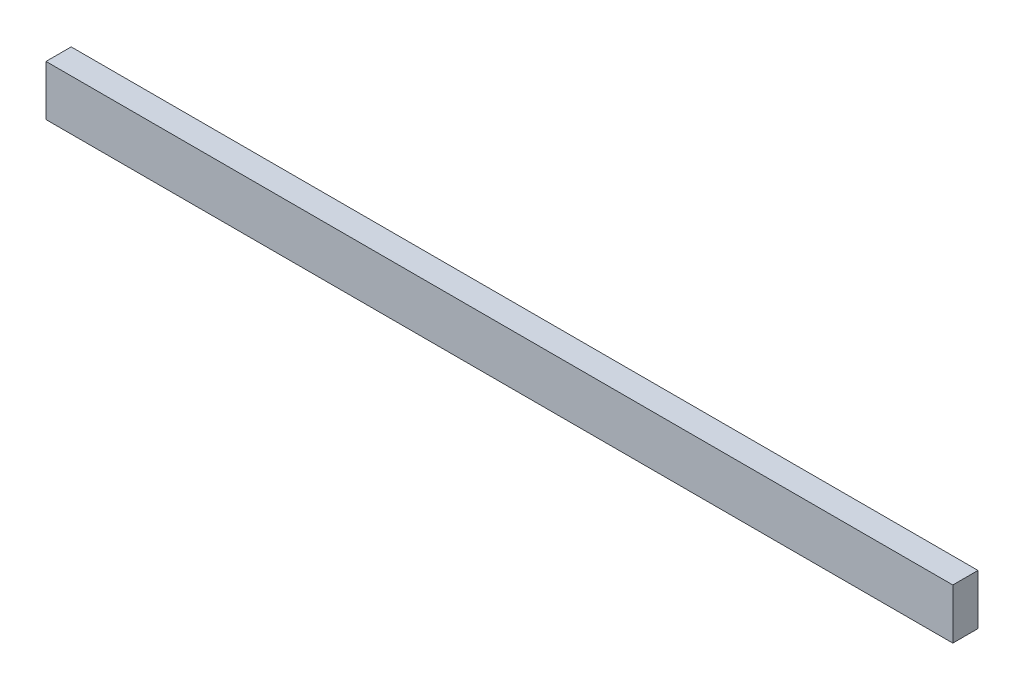
ISO-10303-21;
HEADER;
FILE_DESCRIPTION(('STEP AP214'),'2;1');
FILE_NAME('part.step','',(''),(''),'','','');
FILE_SCHEMA(('AUTOMOTIVE_DESIGN { 1 0 10303 214 1 1 1 1 }'));
ENDSEC;
DATA;
#1=APPLICATION_CONTEXT('core data for automotive mechanical design processes');
#2=APPLICATION_PROTOCOL_DEFINITION('international standard','automotive_design',2000,#1);
#3=PRODUCT_CONTEXT('',#1,'mechanical');
#4=PRODUCT('Part','Part','',(#3));
#5=PRODUCT_RELATED_PRODUCT_CATEGORY('part','',(#4));
#6=PRODUCT_DEFINITION_FORMATION('','',#4);
#7=PRODUCT_DEFINITION_CONTEXT('part definition',#1,'design');
#8=PRODUCT_DEFINITION('design','',#6,#7);
#9=PRODUCT_DEFINITION_SHAPE('','',#8);
#10=(LENGTH_UNIT() NAMED_UNIT(*) SI_UNIT(.MILLI.,.METRE.));
#11=(NAMED_UNIT(*) PLANE_ANGLE_UNIT() SI_UNIT($,.RADIAN.));
#12=(NAMED_UNIT(*) SI_UNIT($,.STERADIAN.) SOLID_ANGLE_UNIT());
#13=UNCERTAINTY_MEASURE_WITH_UNIT(LENGTH_MEASURE(1.E-05),#10,'distance_accuracy_value','');
#14=(GEOMETRIC_REPRESENTATION_CONTEXT(3) GLOBAL_UNCERTAINTY_ASSIGNED_CONTEXT((#13)) GLOBAL_UNIT_ASSIGNED_CONTEXT((#10,
#11,#12)) REPRESENTATION_CONTEXT('',''));
#15=CARTESIAN_POINT('',(0.,0.,0.));
#16=DIRECTION('',(0.,0.,1.));
#17=DIRECTION('',(1.,0.,0.));
#18=AXIS2_PLACEMENT_3D('',#15,#16,#17);
#19=CARTESIAN_POINT('',(1080.,-30.,-15.));
#20=DIRECTION('',(0.,0.,1.));
#21=DIRECTION('',(1.,0.,0.));
#22=AXIS2_PLACEMENT_3D('',#19,#20,#21);
#23=PLANE('',#22);
#24=DIRECTION('',(0.,1.,0.));
#25=VECTOR('',#24,1.);
#26=CARTESIAN_POINT('',(0.,-30.,-15.));
#27=LINE('',#26,#25);
#28=CARTESIAN_POINT('',(0.,-30.,-15.));
#29=VERTEX_POINT('',#28);
#30=CARTESIAN_POINT('',(0.,30.,-15.));
#31=VERTEX_POINT('',#30);
#32=EDGE_CURVE('E107',#29,#31,#27,.T.);
#33=ORIENTED_EDGE('',*,*,#32,.T.);
#34=DIRECTION('',(-1.,0.,0.));
#35=VECTOR('',#34,1.);
#36=CARTESIAN_POINT('',(1080.,30.,-15.));
#37=LINE('',#36,#35);
#38=CARTESIAN_POINT('',(1080.,30.,-15.));
#39=VERTEX_POINT('',#38);
#40=EDGE_CURVE('E11',#39,#31,#37,.T.);
#41=ORIENTED_EDGE('',*,*,#40,.F.);
#42=DIRECTION('',(0.,1.,0.));
#43=VECTOR('',#42,1.);
#44=CARTESIAN_POINT('',(1080.,-30.,-15.));
#45=LINE('',#44,#43);
#46=CARTESIAN_POINT('',(1080.,-30.,-15.));
#47=VERTEX_POINT('',#46);
#48=EDGE_CURVE('E91',#47,#39,#45,.T.);
#49=ORIENTED_EDGE('',*,*,#48,.F.);
#50=DIRECTION('',(-1.,0.,0.));
#51=VECTOR('',#50,1.);
#52=CARTESIAN_POINT('',(1080.,-30.,-15.));
#53=LINE('',#52,#51);
#54=EDGE_CURVE('E103',#47,#29,#53,.T.);
#55=ORIENTED_EDGE('',*,*,#54,.T.);
#56=EDGE_LOOP('',(#33,#41,#49,#55));
#57=FACE_BOUND('',#56,.T.);
#58=ADVANCED_FACE('F39',(#57),#23,.F.);
#59=CARTESIAN_POINT('',(1080.,30.,15.));
#60=DIRECTION('',(0.,-1.,0.));
#61=DIRECTION('',(0.,0.,-1.));
#62=AXIS2_PLACEMENT_3D('',#59,#60,#61);
#63=PLANE('',#62);
#64=DIRECTION('',(0.,0.,1.));
#65=VECTOR('',#64,1.);
#66=CARTESIAN_POINT('',(0.,30.,15.));
#67=LINE('',#66,#65);
#68=CARTESIAN_POINT('',(0.,30.,15.));
#69=VERTEX_POINT('',#68);
#70=EDGE_CURVE('E96',#31,#69,#67,.T.);
#71=ORIENTED_EDGE('',*,*,#70,.T.);
#72=DIRECTION('',(-1.,0.,0.));
#73=VECTOR('',#72,1.);
#74=CARTESIAN_POINT('',(1080.,30.,15.));
#75=LINE('',#74,#73);
#76=CARTESIAN_POINT('',(1080.,30.,15.));
#77=VERTEX_POINT('',#76);
#78=EDGE_CURVE('E48',#77,#69,#75,.T.);
#79=ORIENTED_EDGE('',*,*,#78,.F.);
#80=DIRECTION('',(0.,0.,1.));
#81=VECTOR('',#80,1.);
#82=CARTESIAN_POINT('',(1080.,30.,15.));
#83=LINE('',#82,#81);
#84=EDGE_CURVE('E86',#39,#77,#83,.T.);
#85=ORIENTED_EDGE('',*,*,#84,.F.);
#86=ORIENTED_EDGE('',*,*,#40,.T.);
#87=EDGE_LOOP('',(#71,#79,#85,#86));
#88=FACE_BOUND('',#87,.T.);
#89=ADVANCED_FACE('F95',(#88),#63,.F.);
#90=CARTESIAN_POINT('',(1080.,-30.,15.));
#91=DIRECTION('',(0.,0.,-1.));
#92=DIRECTION('',(-1.,0.,0.));
#93=AXIS2_PLACEMENT_3D('',#90,#91,#92);
#94=PLANE('',#93);
#95=DIRECTION('',(0.,-1.,0.));
#96=VECTOR('',#95,1.);
#97=CARTESIAN_POINT('',(0.,-30.,15.));
#98=LINE('',#97,#96);
#99=CARTESIAN_POINT('',(0.,-30.,15.));
#100=VERTEX_POINT('',#99);
#101=EDGE_CURVE('E73',#69,#100,#98,.T.);
#102=ORIENTED_EDGE('',*,*,#101,.T.);
#103=DIRECTION('',(-1.,0.,0.));
#104=VECTOR('',#103,1.);
#105=CARTESIAN_POINT('',(1080.,-30.,15.));
#106=LINE('',#105,#104);
#107=CARTESIAN_POINT('',(1080.,-30.,15.));
#108=VERTEX_POINT('',#107);
#109=EDGE_CURVE('E98',#108,#100,#106,.T.);
#110=ORIENTED_EDGE('',*,*,#109,.F.);
#111=DIRECTION('',(0.,-1.,0.));
#112=VECTOR('',#111,1.);
#113=CARTESIAN_POINT('',(1080.,-30.,15.));
#114=LINE('',#113,#112);
#115=EDGE_CURVE('E89',#77,#108,#114,.T.);
#116=ORIENTED_EDGE('',*,*,#115,.F.);
#117=ORIENTED_EDGE('',*,*,#78,.T.);
#118=EDGE_LOOP('',(#102,#110,#116,#117));
#119=FACE_BOUND('',#118,.T.);
#120=ADVANCED_FACE('F99',(#119),#94,.F.);
#121=CARTESIAN_POINT('',(1080.,-30.,15.));
#122=DIRECTION('',(0.,1.,0.));
#123=DIRECTION('',(0.,0.,1.));
#124=AXIS2_PLACEMENT_3D('',#121,#122,#123);
#125=PLANE('',#124);
#126=DIRECTION('',(0.,0.,-1.));
#127=VECTOR('',#126,1.);
#128=CARTESIAN_POINT('',(0.,-30.,15.));
#129=LINE('',#128,#127);
#130=EDGE_CURVE('E79',#100,#29,#129,.T.);
#131=ORIENTED_EDGE('',*,*,#130,.T.);
#132=ORIENTED_EDGE('',*,*,#54,.F.);
#133=DIRECTION('',(0.,0.,-1.));
#134=VECTOR('',#133,1.);
#135=CARTESIAN_POINT('',(1080.,-30.,15.));
#136=LINE('',#135,#134);
#137=EDGE_CURVE('E56',#108,#47,#136,.T.);
#138=ORIENTED_EDGE('',*,*,#137,.F.);
#139=ORIENTED_EDGE('',*,*,#109,.T.);
#140=EDGE_LOOP('',(#131,#132,#138,#139));
#141=FACE_BOUND('',#140,.T.);
#142=ADVANCED_FACE('F120',(#141),#125,.F.);
#143=CARTESIAN_POINT('',(1080.,0.,0.));
#144=DIRECTION('',(-1.,0.,0.));
#145=DIRECTION('',(0.,0.,1.));
#146=AXIS2_PLACEMENT_3D('',#143,#144,#145);
#147=PLANE('',#146);
#148=ORIENTED_EDGE('',*,*,#48,.T.);
#149=ORIENTED_EDGE('',*,*,#84,.T.);
#150=ORIENTED_EDGE('',*,*,#115,.T.);
#151=ORIENTED_EDGE('',*,*,#137,.T.);
#152=EDGE_LOOP('',(#148,#149,#150,#151));
#153=FACE_BOUND('',#152,.T.);
#154=ADVANCED_FACE('F87',(#153),#147,.F.);
#155=CARTESIAN_POINT('',(0.,0.,0.));
#156=DIRECTION('',(-1.,0.,0.));
#157=DIRECTION('',(0.,0.,1.));
#158=AXIS2_PLACEMENT_3D('',#155,#156,#157);
#159=PLANE('',#158);
#160=ORIENTED_EDGE('',*,*,#32,.F.);
#161=ORIENTED_EDGE('',*,*,#130,.F.);
#162=ORIENTED_EDGE('',*,*,#101,.F.);
#163=ORIENTED_EDGE('',*,*,#70,.F.);
#164=EDGE_LOOP('',(#160,#161,#162,#163));
#165=FACE_BOUND('',#164,.T.);
#166=ADVANCED_FACE('F123',(#165),#159,.T.);
#167=CLOSED_SHELL('',(#58,#89,#120,#142,#154,#166));
#168=MANIFOLD_SOLID_BREP('B2',#167);
#169=ADVANCED_BREP_SHAPE_REPRESENTATION('',(#18,#168),#14);
#170=SHAPE_DEFINITION_REPRESENTATION(#9,#169);
ENDSEC;
END-ISO-10303-21;
